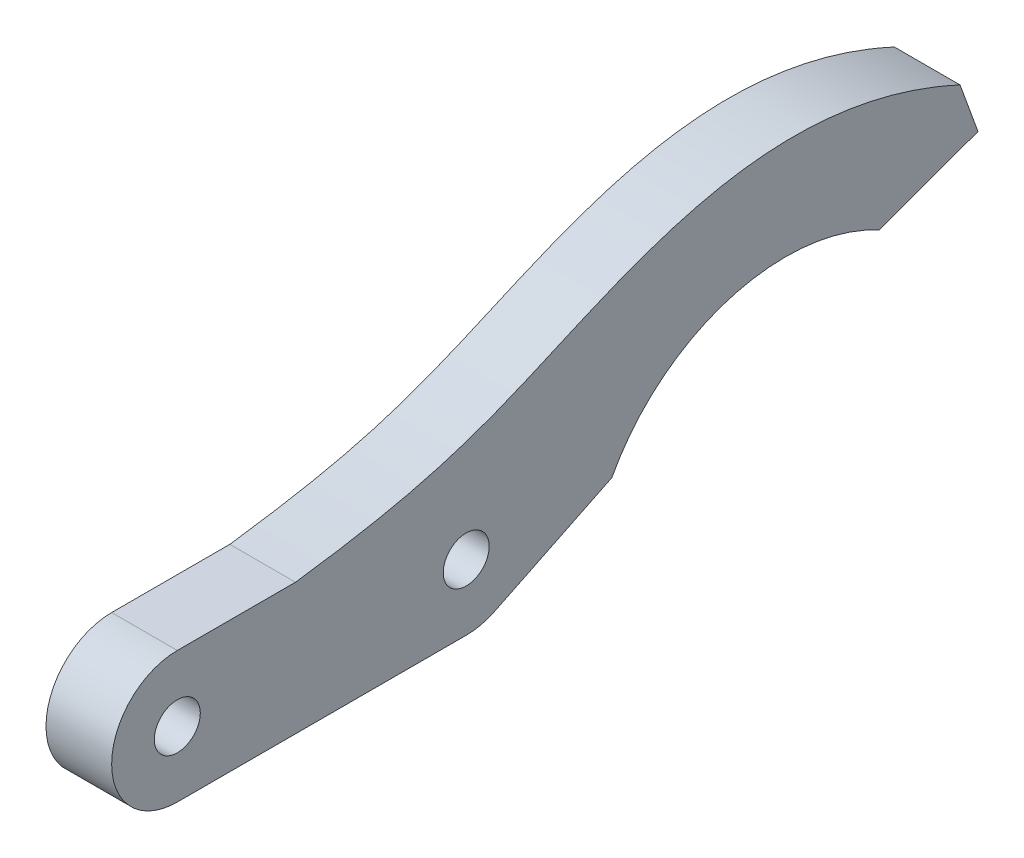
ISO-10303-21;
HEADER;
FILE_DESCRIPTION(('STEP AP214'),'2;1');
FILE_NAME('part.step','',(''),(''),'','','');
FILE_SCHEMA(('AUTOMOTIVE_DESIGN { 1 0 10303 214 1 1 1 1 }'));
ENDSEC;
DATA;
#1=APPLICATION_CONTEXT('core data for automotive mechanical design processes');
#2=APPLICATION_PROTOCOL_DEFINITION('international standard','automotive_design',2000,#1);
#3=PRODUCT_CONTEXT('',#1,'mechanical');
#4=PRODUCT('Part','Part','',(#3));
#5=PRODUCT_RELATED_PRODUCT_CATEGORY('part','',(#4));
#6=PRODUCT_DEFINITION_FORMATION('','',#4);
#7=PRODUCT_DEFINITION_CONTEXT('part definition',#1,'design');
#8=PRODUCT_DEFINITION('design','',#6,#7);
#9=PRODUCT_DEFINITION_SHAPE('','',#8);
#10=(LENGTH_UNIT() NAMED_UNIT(*) SI_UNIT(.MILLI.,.METRE.));
#11=(NAMED_UNIT(*) PLANE_ANGLE_UNIT() SI_UNIT($,.RADIAN.));
#12=(NAMED_UNIT(*) SI_UNIT($,.STERADIAN.) SOLID_ANGLE_UNIT());
#13=UNCERTAINTY_MEASURE_WITH_UNIT(LENGTH_MEASURE(1.E-05),#10,'distance_accuracy_value','');
#14=(GEOMETRIC_REPRESENTATION_CONTEXT(3) GLOBAL_UNCERTAINTY_ASSIGNED_CONTEXT((#13)) GLOBAL_UNIT_ASSIGNED_CONTEXT((#10,
#11,#12)) REPRESENTATION_CONTEXT('',''));
#15=CARTESIAN_POINT('',(0.,0.,0.));
#16=DIRECTION('',(0.,0.,1.));
#17=DIRECTION('',(1.,0.,0.));
#18=AXIS2_PLACEMENT_3D('',#15,#16,#17);
#19=CARTESIAN_POINT('',(5.,5.,-27.));
#20=DIRECTION('',(-1.,0.,0.));
#21=DIRECTION('',(0.,0.,1.));
#22=AXIS2_PLACEMENT_3D('',#19,#20,#21);
#23=CYLINDRICAL_SURFACE('',#22,5.);
#24=DIRECTION('',(1.,0.,0.));
#25=VECTOR('',#24,1.);
#26=CARTESIAN_POINT('',(-57.0397118623607,0.506029768504152,-29.1918557339454));
#27=LINE('',#26,#25);
#28=CARTESIAN_POINT('',(0.,0.506029768504152,-29.1918557339454));
#29=VERTEX_POINT('',#28);
#30=CARTESIAN_POINT('',(5.,0.506029768504152,-29.1918557339454));
#31=VERTEX_POINT('',#30);
#32=EDGE_CURVE('E62',#29,#31,#27,.T.);
#33=ORIENTED_EDGE('',*,*,#32,.T.);
#34=CARTESIAN_POINT('',(5.,5.,-27.));
#35=DIRECTION('',(1.,0.,0.));
#36=DIRECTION('',(0.,0.,-1.));
#37=AXIS2_PLACEMENT_3D('',#34,#35,#36);
#38=CIRCLE('',#37,5.);
#39=CARTESIAN_POINT('',(5.,0.,-27.));
#40=VERTEX_POINT('',#39);
#41=EDGE_CURVE('E135',#40,#31,#38,.T.);
#42=ORIENTED_EDGE('',*,*,#41,.F.);
#43=DIRECTION('',(-1.,0.,0.));
#44=VECTOR('',#43,1.);
#45=CARTESIAN_POINT('',(5.,0.,-27.));
#46=LINE('',#45,#44);
#47=CARTESIAN_POINT('',(0.,0.,-27.));
#48=VERTEX_POINT('',#47);
#49=EDGE_CURVE('E47',#40,#48,#46,.T.);
#50=ORIENTED_EDGE('',*,*,#49,.T.);
#51=CARTESIAN_POINT('',(0.,5.,-27.));
#52=DIRECTION('',(1.,0.,0.));
#53=DIRECTION('',(0.,0.,-1.));
#54=AXIS2_PLACEMENT_3D('',#51,#52,#53);
#55=CIRCLE('',#54,5.);
#56=EDGE_CURVE('E181',#48,#29,#55,.T.);
#57=ORIENTED_EDGE('',*,*,#56,.T.);
#58=EDGE_LOOP('',(#33,#42,#50,#57));
#59=FACE_BOUND('',#58,.T.);
#60=ADVANCED_FACE('F39',(#59),#23,.T.);
#61=CARTESIAN_POINT('',(5.,10.,0.));
#62=DIRECTION('',(0.,1.,0.));
#63=DIRECTION('',(0.,0.,1.));
#64=AXIS2_PLACEMENT_3D('',#61,#62,#63);
#65=PLANE('',#64);
#66=DIRECTION('',(0.,0.,-1.));
#67=VECTOR('',#66,1.);
#68=CARTESIAN_POINT('',(5.,10.,0.));
#69=LINE('',#68,#67);
#70=CARTESIAN_POINT('',(5.,10.,-5.));
#71=VERTEX_POINT('',#70);
#72=CARTESIAN_POINT('',(5.,10.,-14.));
#73=VERTEX_POINT('',#72);
#74=EDGE_CURVE('E54',#71,#73,#69,.T.);
#75=ORIENTED_EDGE('',*,*,#74,.T.);
#76=DIRECTION('',(1.,0.,0.));
#77=VECTOR('',#76,1.);
#78=CARTESIAN_POINT('',(-57.0397118623607,10.,-14.));
#79=LINE('',#78,#77);
#80=CARTESIAN_POINT('',(0.,10.,-14.));
#81=VERTEX_POINT('',#80);
#82=EDGE_CURVE('E148',#81,#73,#79,.T.);
#83=ORIENTED_EDGE('',*,*,#82,.F.);
#84=DIRECTION('',(0.,0.,-1.));
#85=VECTOR('',#84,1.);
#86=CARTESIAN_POINT('',(0.,10.,0.));
#87=LINE('',#86,#85);
#88=CARTESIAN_POINT('',(0.,10.,-5.));
#89=VERTEX_POINT('',#88);
#90=EDGE_CURVE('E183',#89,#81,#87,.T.);
#91=ORIENTED_EDGE('',*,*,#90,.F.);
#92=DIRECTION('',(-1.,0.,0.));
#93=VECTOR('',#92,1.);
#94=CARTESIAN_POINT('',(5.,10.,-5.));
#95=LINE('',#94,#93);
#96=EDGE_CURVE('E170',#71,#89,#95,.T.);
#97=ORIENTED_EDGE('',*,*,#96,.F.);
#98=EDGE_LOOP('',(#75,#83,#91,#97));
#99=FACE_BOUND('',#98,.T.);
#100=ADVANCED_FACE('F202',(#99),#65,.T.);
#101=CARTESIAN_POINT('',(5.,5.,-5.));
#102=DIRECTION('',(-1.,0.,0.));
#103=DIRECTION('',(0.,0.,1.));
#104=AXIS2_PLACEMENT_3D('',#101,#102,#103);
#105=CYLINDRICAL_SURFACE('',#104,5.);
#106=CARTESIAN_POINT('',(0.,5.,-5.));
#107=DIRECTION('',(1.,0.,0.));
#108=DIRECTION('',(0.,0.,-1.));
#109=AXIS2_PLACEMENT_3D('',#106,#107,#108);
#110=CIRCLE('',#109,5.);
#111=CARTESIAN_POINT('',(0.,0.,-5.));
#112=VERTEX_POINT('',#111);
#113=EDGE_CURVE('E174',#89,#112,#110,.T.);
#114=ORIENTED_EDGE('',*,*,#113,.T.);
#115=DIRECTION('',(-1.,0.,0.));
#116=VECTOR('',#115,1.);
#117=CARTESIAN_POINT('',(5.,0.,-5.));
#118=LINE('',#117,#116);
#119=CARTESIAN_POINT('',(5.,0.,-5.));
#120=VERTEX_POINT('',#119);
#121=EDGE_CURVE('E11',#120,#112,#118,.T.);
#122=ORIENTED_EDGE('',*,*,#121,.F.);
#123=CARTESIAN_POINT('',(5.,5.,-5.));
#124=DIRECTION('',(1.,0.,0.));
#125=DIRECTION('',(0.,0.,-1.));
#126=AXIS2_PLACEMENT_3D('',#123,#124,#125);
#127=CIRCLE('',#126,5.);
#128=EDGE_CURVE('E159',#71,#120,#127,.T.);
#129=ORIENTED_EDGE('',*,*,#128,.F.);
#130=ORIENTED_EDGE('',*,*,#96,.T.);
#131=EDGE_LOOP('',(#114,#122,#129,#130));
#132=FACE_BOUND('',#131,.T.);
#133=ADVANCED_FACE('F199',(#132),#105,.T.);
#134=CARTESIAN_POINT('',(5.,0.,0.));
#135=DIRECTION('',(0.,-1.,0.));
#136=DIRECTION('',(0.,0.,-1.));
#137=AXIS2_PLACEMENT_3D('',#134,#135,#136);
#138=PLANE('',#137);
#139=DIRECTION('',(0.,0.,1.));
#140=VECTOR('',#139,1.);
#141=CARTESIAN_POINT('',(0.,0.,0.));
#142=LINE('',#141,#140);
#143=EDGE_CURVE('E178',#48,#112,#142,.T.);
#144=ORIENTED_EDGE('',*,*,#143,.F.);
#145=ORIENTED_EDGE('',*,*,#49,.F.);
#146=DIRECTION('',(0.,0.,1.));
#147=VECTOR('',#146,1.);
#148=CARTESIAN_POINT('',(5.,0.,0.));
#149=LINE('',#148,#147);
#150=EDGE_CURVE('E162',#40,#120,#149,.T.);
#151=ORIENTED_EDGE('',*,*,#150,.T.);
#152=ORIENTED_EDGE('',*,*,#121,.T.);
#153=EDGE_LOOP('',(#144,#145,#151,#152));
#154=FACE_BOUND('',#153,.T.);
#155=ADVANCED_FACE('F195',(#154),#138,.T.);
#156=CARTESIAN_POINT('',(5.,5.,-5.));
#157=DIRECTION('',(-1.,0.,0.));
#158=DIRECTION('',(0.,0.,1.));
#159=AXIS2_PLACEMENT_3D('',#156,#157,#158);
#160=CYLINDRICAL_SURFACE('',#159,1.75);
#161=CARTESIAN_POINT('',(5.,5.,-5.));
#162=DIRECTION('',(1.,0.,0.));
#163=DIRECTION('',(0.,0.,-1.));
#164=AXIS2_PLACEMENT_3D('',#161,#162,#163);
#165=CIRCLE('',#164,1.75);
#166=CARTESIAN_POINT('',(5.,5.,-6.75));
#167=VERTEX_POINT('',#166);
#168=EDGE_CURVE('E156',#167,#167,#165,.T.);
#169=ORIENTED_EDGE('',*,*,#168,.T.);
#170=EDGE_LOOP('',(#169));
#171=FACE_BOUND('',#170,.T.);
#172=CARTESIAN_POINT('',(0.,5.,-5.));
#173=DIRECTION('',(1.,0.,0.));
#174=DIRECTION('',(0.,0.,-1.));
#175=AXIS2_PLACEMENT_3D('',#172,#173,#174);
#176=CIRCLE('',#175,1.75);
#177=CARTESIAN_POINT('',(0.,5.,-6.75));
#178=VERTEX_POINT('',#177);
#179=EDGE_CURVE('E171',#178,#178,#176,.T.);
#180=ORIENTED_EDGE('',*,*,#179,.F.);
#181=EDGE_LOOP('',(#180));
#182=FACE_BOUND('',#181,.T.);
#183=ADVANCED_FACE('F41',(#171,#182),#160,.F.);
#184=CARTESIAN_POINT('',(5.,5.,-27.));
#185=DIRECTION('',(-1.,0.,0.));
#186=DIRECTION('',(0.,0.,1.));
#187=AXIS2_PLACEMENT_3D('',#184,#185,#186);
#188=CYLINDRICAL_SURFACE('',#187,1.75);
#189=CARTESIAN_POINT('',(5.,5.,-27.));
#190=DIRECTION('',(1.,0.,0.));
#191=DIRECTION('',(0.,0.,-1.));
#192=AXIS2_PLACEMENT_3D('',#189,#190,#191);
#193=CIRCLE('',#192,1.75);
#194=CARTESIAN_POINT('',(5.,5.,-28.75));
#195=VERTEX_POINT('',#194);
#196=EDGE_CURVE('E167',#195,#195,#193,.T.);
#197=ORIENTED_EDGE('',*,*,#196,.T.);
#198=EDGE_LOOP('',(#197));
#199=FACE_BOUND('',#198,.T.);
#200=CARTESIAN_POINT('',(0.,5.,-27.));
#201=DIRECTION('',(1.,0.,0.));
#202=DIRECTION('',(0.,0.,-1.));
#203=AXIS2_PLACEMENT_3D('',#200,#201,#202);
#204=CIRCLE('',#203,1.75);
#205=CARTESIAN_POINT('',(0.,5.,-28.75));
#206=VERTEX_POINT('',#205);
#207=EDGE_CURVE('E160',#206,#206,#204,.T.);
#208=ORIENTED_EDGE('',*,*,#207,.F.);
#209=EDGE_LOOP('',(#208));
#210=FACE_BOUND('',#209,.T.);
#211=ADVANCED_FACE('F237',(#199,#210),#188,.F.);
#212=CARTESIAN_POINT('',(5.,0.,0.));
#213=DIRECTION('',(1.,0.,0.));
#214=DIRECTION('',(0.,0.,-1.));
#215=AXIS2_PLACEMENT_3D('',#212,#213,#214);
#216=PLANE('',#215);
#217=CARTESIAN_POINT('',(5.,10.,-14.));
#218=CARTESIAN_POINT('',(5.,11.1657482071513,-22.7296589277984));
#219=CARTESIAN_POINT('',(5.,15.05994272624,-34.565066024103));
#220=CARTESIAN_POINT('',(5.,24.0018932847235,-50.5565545225831));
#221=CARTESIAN_POINT('',(5.,17.494931629749,-64.6076168916504));
#222=B_SPLINE_CURVE_WITH_KNOTS('',3,(#217,#218,#219,#220,#221),.UNSPECIFIED.,.F.,.F.,(4,1,4),
(0.,0.349113353230096,1.),.UNSPECIFIED.);
#223=CARTESIAN_POINT('',(5.,17.494931629749,-64.6076168916504));
#224=VERTEX_POINT('',#223);
#225=EDGE_CURVE('E136',#73,#224,#222,.T.);
#226=ORIENTED_EDGE('',*,*,#225,.F.);
#227=ORIENTED_EDGE('',*,*,#74,.F.);
#228=ORIENTED_EDGE('',*,*,#128,.T.);
#229=ORIENTED_EDGE('',*,*,#150,.F.);
#230=ORIENTED_EDGE('',*,*,#41,.T.);
#231=DIRECTION('',(0.,-0.438371146789072,0.89879404629917));
#232=VECTOR('',#231,1.);
#233=CARTESIAN_POINT('',(5.,-11.0929617168723,-5.41039893303206));
#234=LINE('',#233,#232);
#235=CARTESIAN_POINT('',(5.,4.84590412171597,-38.0899167923071));
#236=VERTEX_POINT('',#235);
#237=EDGE_CURVE('E115',#236,#31,#234,.T.);
#238=ORIENTED_EDGE('',*,*,#237,.F.);
#239=CARTESIAN_POINT('',(5.,-2.19938854159997,-51.3324184928253));
#240=DIRECTION('',(1.,0.,0.));
#241=DIRECTION('',(0.,0.,-1.));
#242=AXIS2_PLACEMENT_3D('',#239,#240,#241);
#243=CIRCLE('',#242,15.);
#244=CARTESIAN_POINT('',(5.,11.,-58.4581564986658));
#245=VERTEX_POINT('',#244);
#246=EDGE_CURVE('E123',#245,#236,#243,.T.);
#247=ORIENTED_EDGE('',*,*,#246,.F.);
#248=DIRECTION('',(0.,-0.342020143325667,0.939692620785909));
#249=VECTOR('',#248,1.);
#250=CARTESIAN_POINT('',(5.,-9.074844904075,-3.30297342566561));
#251=LINE('',#250,#249);
#252=CARTESIAN_POINT('',(5.,13.7361611466053,-65.975697464953));
#253=VERTEX_POINT('',#252);
#254=EDGE_CURVE('E129',#253,#245,#251,.T.);
#255=ORIENTED_EDGE('',*,*,#254,.F.);
#256=DIRECTION('',(0.,-0.939692620785909,-0.342020143325666));
#257=VECTOR('',#256,1.);
#258=CARTESIAN_POINT('',(5.,22.8110060506803,-62.6727240392874));
#259=LINE('',#258,#257);
#260=EDGE_CURVE('E145',#224,#253,#259,.T.);
#261=ORIENTED_EDGE('',*,*,#260,.F.);
#262=EDGE_LOOP('',(#226,#227,#228,#229,#230,#238,#247,#255,#261));
#263=FACE_BOUND('',#262,.T.);
#264=ORIENTED_EDGE('',*,*,#168,.F.);
#265=EDGE_LOOP('',(#264));
#266=FACE_BOUND('',#265,.T.);
#267=ORIENTED_EDGE('',*,*,#196,.F.);
#268=EDGE_LOOP('',(#267));
#269=FACE_BOUND('',#268,.T.);
#270=ADVANCED_FACE('F132',(#263,#266,#269),#216,.T.);
#271=CARTESIAN_POINT('',(0.,0.,0.));
#272=DIRECTION('',(1.,0.,0.));
#273=DIRECTION('',(0.,0.,-1.));
#274=AXIS2_PLACEMENT_3D('',#271,#272,#273);
#275=PLANE('',#274);
#276=ORIENTED_EDGE('',*,*,#179,.T.);
#277=EDGE_LOOP('',(#276));
#278=FACE_BOUND('',#277,.T.);
#279=ORIENTED_EDGE('',*,*,#113,.F.);
#280=ORIENTED_EDGE('',*,*,#90,.T.);
#281=CARTESIAN_POINT('',(0.,10.,-14.));
#282=CARTESIAN_POINT('',(0.,11.1657482071513,-22.7296589277984));
#283=CARTESIAN_POINT('',(0.,15.05994272624,-34.565066024103));
#284=CARTESIAN_POINT('',(0.,24.0018932847235,-50.5565545225831));
#285=CARTESIAN_POINT('',(0.,17.494931629749,-64.6076168916504));
#286=B_SPLINE_CURVE_WITH_KNOTS('',3,(#281,#282,#283,#284,#285),.UNSPECIFIED.,.F.,.F.,(4,1,4),
(0.,0.349113353230096,1.),.UNSPECIFIED.);
#287=CARTESIAN_POINT('',(0.,17.494931629749,-64.6076168916504));
#288=VERTEX_POINT('',#287);
#289=EDGE_CURVE('E175',#288,#81,#286,.F.);
#290=ORIENTED_EDGE('',*,*,#289,.F.);
#291=DIRECTION('',(0.,0.93969262078591,0.342020143325666));
#292=VECTOR('',#291,1.);
#293=CARTESIAN_POINT('',(0.,22.8110060506803,-62.6727240392874));
#294=LINE('',#293,#292);
#295=CARTESIAN_POINT('',(0.,13.7361611466053,-65.975697464953));
#296=VERTEX_POINT('',#295);
#297=EDGE_CURVE('E212',#296,#288,#294,.T.);
#298=ORIENTED_EDGE('',*,*,#297,.F.);
#299=DIRECTION('',(0.,0.342020143325666,-0.939692620785909));
#300=VECTOR('',#299,1.);
#301=CARTESIAN_POINT('',(0.,-9.074844904075,-3.30297342566561));
#302=LINE('',#301,#300);
#303=CARTESIAN_POINT('',(0.,11.,-58.4581564986658));
#304=VERTEX_POINT('',#303);
#305=EDGE_CURVE('E213',#304,#296,#302,.T.);
#306=ORIENTED_EDGE('',*,*,#305,.F.);
#307=CARTESIAN_POINT('',(0.,-2.19938854159997,-51.3324184928253));
#308=DIRECTION('',(1.,0.,0.));
#309=DIRECTION('',(0.,0.,-1.));
#310=AXIS2_PLACEMENT_3D('',#307,#308,#309);
#311=CIRCLE('',#310,15.);
#312=CARTESIAN_POINT('',(0.,4.84590412171597,-38.0899167923071));
#313=VERTEX_POINT('',#312);
#314=EDGE_CURVE('E216',#313,#304,#311,.F.);
#315=ORIENTED_EDGE('',*,*,#314,.F.);
#316=DIRECTION('',(0.,0.438371146789072,-0.89879404629917));
#317=VECTOR('',#316,1.);
#318=CARTESIAN_POINT('',(0.,-11.0929617168723,-5.41039893303206));
#319=LINE('',#318,#317);
#320=EDGE_CURVE('E117',#29,#313,#319,.T.);
#321=ORIENTED_EDGE('',*,*,#320,.F.);
#322=ORIENTED_EDGE('',*,*,#56,.F.);
#323=ORIENTED_EDGE('',*,*,#143,.T.);
#324=EDGE_LOOP('',(#279,#280,#290,#298,#306,#315,#321,#322,#323));
#325=FACE_BOUND('',#324,.T.);
#326=ORIENTED_EDGE('',*,*,#207,.T.);
#327=EDGE_LOOP('',(#326));
#328=FACE_BOUND('',#327,.T.);
#329=ADVANCED_FACE('F193',(#278,#325,#328),#275,.F.);
#330=CARTESIAN_POINT('',(-57.0397118623607,-11.0929617168723,-5.41039893303206));
#331=DIRECTION('',(0.,0.89879404629917,0.438371146789072));
#332=DIRECTION('',(0.,-0.438371146789072,0.89879404629917));
#333=AXIS2_PLACEMENT_3D('',#330,#331,#332);
#334=PLANE('',#333);
#335=ORIENTED_EDGE('',*,*,#32,.F.);
#336=ORIENTED_EDGE('',*,*,#320,.T.);
#337=DIRECTION('',(1.,0.,0.));
#338=VECTOR('',#337,1.);
#339=CARTESIAN_POINT('',(-57.0397118623607,4.84590412171597,-38.0899167923071));
#340=LINE('',#339,#338);
#341=EDGE_CURVE('E111',#313,#236,#340,.T.);
#342=ORIENTED_EDGE('',*,*,#341,.T.);
#343=ORIENTED_EDGE('',*,*,#237,.T.);
#344=EDGE_LOOP('',(#335,#336,#342,#343));
#345=FACE_BOUND('',#344,.T.);
#346=ADVANCED_FACE('F113',(#345),#334,.F.);
#347=CARTESIAN_POINT('',(-57.0397118623607,-2.19938854159997,-51.3324184928253));
#348=DIRECTION('',(1.,0.,0.));
#349=DIRECTION('',(0.,0.,-1.));
#350=AXIS2_PLACEMENT_3D('',#347,#348,#349);
#351=CYLINDRICAL_SURFACE('',#350,15.);
#352=ORIENTED_EDGE('',*,*,#341,.F.);
#353=ORIENTED_EDGE('',*,*,#314,.T.);
#354=DIRECTION('',(1.,0.,0.));
#355=VECTOR('',#354,1.);
#356=CARTESIAN_POINT('',(-57.0397118623607,11.,-58.4581564986658));
#357=LINE('',#356,#355);
#358=EDGE_CURVE('E120',#304,#245,#357,.T.);
#359=ORIENTED_EDGE('',*,*,#358,.T.);
#360=ORIENTED_EDGE('',*,*,#246,.T.);
#361=EDGE_LOOP('',(#352,#353,#359,#360));
#362=FACE_BOUND('',#361,.T.);
#363=ADVANCED_FACE('F124',(#362),#351,.F.);
#364=CARTESIAN_POINT('',(-57.0397118623607,-9.074844904075,-3.30297342566561));
#365=DIRECTION('',(0.,0.939692620785909,0.342020143325666));
#366=DIRECTION('',(0.,-0.342020143325666,0.939692620785909));
#367=AXIS2_PLACEMENT_3D('',#364,#365,#366);
#368=PLANE('',#367);
#369=ORIENTED_EDGE('',*,*,#358,.F.);
#370=ORIENTED_EDGE('',*,*,#305,.T.);
#371=DIRECTION('',(1.,0.,0.));
#372=VECTOR('',#371,1.);
#373=CARTESIAN_POINT('',(-57.0397118623607,13.7361611466053,-65.975697464953));
#374=LINE('',#373,#372);
#375=EDGE_CURVE('E151',#296,#253,#374,.T.);
#376=ORIENTED_EDGE('',*,*,#375,.T.);
#377=ORIENTED_EDGE('',*,*,#254,.T.);
#378=EDGE_LOOP('',(#369,#370,#376,#377));
#379=FACE_BOUND('',#378,.T.);
#380=ADVANCED_FACE('F288',(#379),#368,.F.);
#381=CARTESIAN_POINT('',(-57.0397118623607,22.8110060506803,-62.6727240392874));
#382=DIRECTION('',(0.,-0.342020143325666,0.93969262078591));
#383=DIRECTION('',(0.,-0.93969262078591,-0.342020143325666));
#384=AXIS2_PLACEMENT_3D('',#381,#382,#383);
#385=PLANE('',#384);
#386=ORIENTED_EDGE('',*,*,#375,.F.);
#387=ORIENTED_EDGE('',*,*,#297,.T.);
#388=DIRECTION('',(1.,0.,0.));
#389=VECTOR('',#388,1.);
#390=CARTESIAN_POINT('',(-57.0397118623607,17.494931629749,-64.6076168916504));
#391=LINE('',#390,#389);
#392=EDGE_CURVE('E149',#288,#224,#391,.T.);
#393=ORIENTED_EDGE('',*,*,#392,.T.);
#394=ORIENTED_EDGE('',*,*,#260,.T.);
#395=EDGE_LOOP('',(#386,#387,#393,#394));
#396=FACE_BOUND('',#395,.T.);
#397=ADVANCED_FACE('F209',(#396),#385,.F.);
#398=CARTESIAN_POINT('',(-57.0397118623607,10.,-14.));
#399=CARTESIAN_POINT('',(-57.0397118623607,11.1657482071513,-22.7296589277984));
#400=CARTESIAN_POINT('',(-57.0397118623607,15.05994272624,-34.565066024103));
#401=CARTESIAN_POINT('',(-57.0397118623607,24.0018932847235,-50.5565545225831));
#402=CARTESIAN_POINT('',(-57.0397118623607,17.494931629749,-64.6076168916504));
#403=B_SPLINE_CURVE_WITH_KNOTS('',3,(#398,#399,#400,#401,#402),.UNSPECIFIED.,.F.,.F.,(4,1,4),
(0.,0.349113353230096,1.),.UNSPECIFIED.);
#404=DIRECTION('',(1.,0.,0.));
#405=VECTOR('',#404,1.);
#406=SURFACE_OF_LINEAR_EXTRUSION('',#403,#405);
#407=ORIENTED_EDGE('',*,*,#392,.F.);
#408=ORIENTED_EDGE('',*,*,#289,.T.);
#409=ORIENTED_EDGE('',*,*,#82,.T.);
#410=ORIENTED_EDGE('',*,*,#225,.T.);
#411=EDGE_LOOP('',(#407,#408,#409,#410));
#412=FACE_BOUND('',#411,.T.);
#413=ADVANCED_FACE('F205',(#412),#406,.F.);
#414=CLOSED_SHELL('',(#60,#100,#133,#155,#183,#211,#270,#329,#346,#363,#380,#397,#413));
#415=MANIFOLD_SOLID_BREP('B2',#414);
#416=ADVANCED_BREP_SHAPE_REPRESENTATION('',(#18,#415),#14);
#417=SHAPE_DEFINITION_REPRESENTATION(#9,#416);
ENDSEC;
END-ISO-10303-21;
